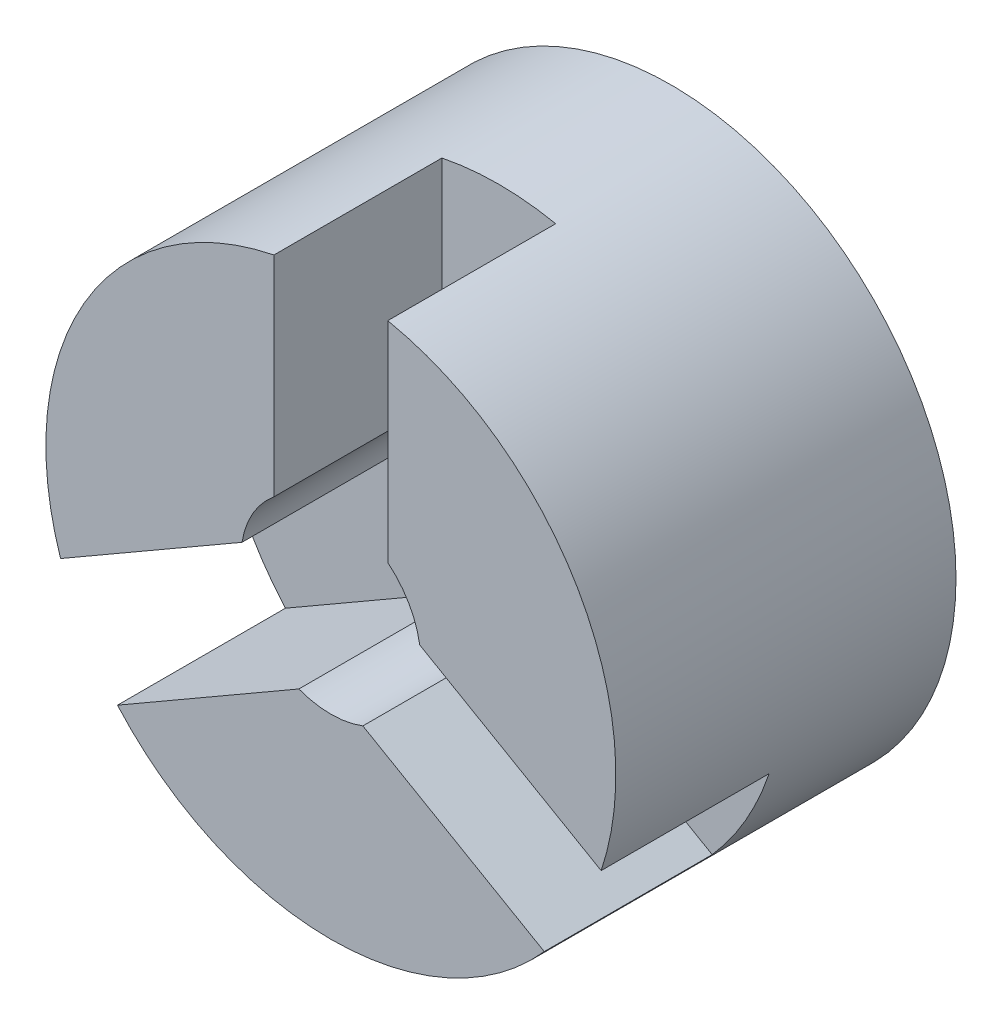
ISO-10303-21;
HEADER;
FILE_DESCRIPTION(('STEP AP214'),'2;1');
FILE_NAME('part.step','',(''),(''),'','','');
FILE_SCHEMA(('AUTOMOTIVE_DESIGN { 1 0 10303 214 1 1 1 1 }'));
ENDSEC;
DATA;
#1=APPLICATION_CONTEXT('core data for automotive mechanical design processes');
#2=APPLICATION_PROTOCOL_DEFINITION('international standard','automotive_design',2000,#1);
#3=PRODUCT_CONTEXT('',#1,'mechanical');
#4=PRODUCT('Part','Part','',(#3));
#5=PRODUCT_RELATED_PRODUCT_CATEGORY('part','',(#4));
#6=PRODUCT_DEFINITION_FORMATION('','',#4);
#7=PRODUCT_DEFINITION_CONTEXT('part definition',#1,'design');
#8=PRODUCT_DEFINITION('design','',#6,#7);
#9=PRODUCT_DEFINITION_SHAPE('','',#8);
#10=(LENGTH_UNIT() NAMED_UNIT(*) SI_UNIT(.MILLI.,.METRE.));
#11=(NAMED_UNIT(*) PLANE_ANGLE_UNIT() SI_UNIT($,.RADIAN.));
#12=(NAMED_UNIT(*) SI_UNIT($,.STERADIAN.) SOLID_ANGLE_UNIT());
#13=UNCERTAINTY_MEASURE_WITH_UNIT(LENGTH_MEASURE(1.E-05),#10,'distance_accuracy_value','');
#14=(GEOMETRIC_REPRESENTATION_CONTEXT(3) GLOBAL_UNCERTAINTY_ASSIGNED_CONTEXT((#13)) GLOBAL_UNIT_ASSIGNED_CONTEXT((#10,
#11,#12)) REPRESENTATION_CONTEXT('',''));
#15=CARTESIAN_POINT('',(0.,0.,0.));
#16=DIRECTION('',(0.,0.,1.));
#17=DIRECTION('',(1.,0.,0.));
#18=AXIS2_PLACEMENT_3D('',#15,#16,#17);
#19=CARTESIAN_POINT('',(4.9911,0.,20.107999916));
#20=DIRECTION('',(0.,0.,1.));
#21=DIRECTION('',(1.,0.,0.));
#22=AXIS2_PLACEMENT_3D('',#19,#20,#21);
#23=PLANE('',#22);
#24=CARTESIAN_POINT('',(0.,0.,20.107999916));
#25=DIRECTION('',(0.,0.,1.));
#26=DIRECTION('',(1.,0.,0.));
#27=AXIS2_PLACEMENT_3D('',#24,#25,#26);
#28=CIRCLE('',#27,7.8994);
#29=CARTESIAN_POINT('',(4.9911,6.12286216976995,20.107999916));
#30=VERTEX_POINT('',#29);
#31=CARTESIAN_POINT('',(-4.9911,6.12286216976995,20.107999916));
#32=VERTEX_POINT('',#31);
#33=EDGE_CURVE('E232',#30,#32,#28,.T.);
#34=ORIENTED_EDGE('',*,*,#33,.F.);
#35=DIRECTION('',(0.,1.,0.));
#36=VECTOR('',#35,1.);
#37=CARTESIAN_POINT('',(4.9911,0.,20.107999916));
#38=LINE('',#37,#36);
#39=CARTESIAN_POINT('',(4.9911,24.4967124486124,20.107999916));
#40=VERTEX_POINT('',#39);
#41=EDGE_CURVE('E172',#30,#40,#38,.T.);
#42=ORIENTED_EDGE('',*,*,#41,.T.);
#43=CARTESIAN_POINT('',(0.,0.,20.107999916));
#44=DIRECTION('',(0.,0.,1.));
#45=DIRECTION('',(1.,0.,0.));
#46=AXIS2_PLACEMENT_3D('',#43,#44,#45);
#47=CIRCLE('',#46,25.);
#48=CARTESIAN_POINT('',(-4.9911,24.4967124486124,20.107999916));
#49=VERTEX_POINT('',#48);
#50=EDGE_CURVE('E40',#40,#49,#47,.T.);
#51=ORIENTED_EDGE('',*,*,#50,.T.);
#52=DIRECTION('',(0.,-1.,0.));
#53=VECTOR('',#52,1.);
#54=CARTESIAN_POINT('',(-4.9911,26.8858011323426,20.107999916));
#55=LINE('',#54,#53);
#56=EDGE_CURVE('E174',#49,#32,#55,.T.);
#57=ORIENTED_EDGE('',*,*,#56,.T.);
#58=EDGE_LOOP('',(#34,#42,#51,#57));
#59=FACE_BOUND('',#58,.T.);
#60=ADVANCED_FACE('F32',(#59),#23,.T.);
#61=CARTESIAN_POINT('',(-7.79810418289149,1.2609883079435,20.107999916));
#62=VERTEX_POINT('',#61);
#63=CARTESIAN_POINT('',(-2.80700418289145,-7.3838504777135,20.107999916));
#64=VERTEX_POINT('',#63);
#65=EDGE_CURVE('E227',#62,#64,#28,.T.);
#66=ORIENTED_EDGE('',*,*,#65,.F.);
#67=DIRECTION('',(-0.866025403784436,-0.500000000000004,0.));
#68=VECTOR('',#67,1.);
#69=CARTESIAN_POINT('',(-2.49555000000002,4.3224193928285,20.107999916));
#70=LINE('',#69,#68);
#71=CARTESIAN_POINT('',(-23.7103252897008,-7.92593683147778,20.107999916));
#72=VERTEX_POINT('',#71);
#73=EDGE_CURVE('E149',#62,#72,#70,.T.);
#74=ORIENTED_EDGE('',*,*,#73,.T.);
#75=CARTESIAN_POINT('',(0.,0.,20.107999916));
#76=DIRECTION('',(0.,0.,1.));
#77=DIRECTION('',(1.,0.,0.));
#78=AXIS2_PLACEMENT_3D('',#75,#76,#77);
#79=CIRCLE('',#78,25.);
#80=CARTESIAN_POINT('',(-18.7192252897007,-16.5707756171348,20.107999916));
#81=VERTEX_POINT('',#80);
#82=EDGE_CURVE('E161',#72,#81,#79,.T.);
#83=ORIENTED_EDGE('',*,*,#82,.T.);
#84=DIRECTION('',(0.866025403784436,0.500000000000004,0.));
#85=VECTOR('',#84,1.);
#86=CARTESIAN_POINT('',(-20.7882367817051,-17.7653199589999,20.107999916));
#87=LINE('',#86,#85);
#88=EDGE_CURVE('E151',#81,#64,#87,.T.);
#89=ORIENTED_EDGE('',*,*,#88,.T.);
#90=EDGE_LOOP('',(#66,#74,#83,#89));
#91=FACE_BOUND('',#90,.T.);
#92=ADVANCED_FACE('F277',(#91),#23,.T.);
#93=CARTESIAN_POINT('',(0.,0.,34.839999916));
#94=DIRECTION('',(0.,0.,1.));
#95=DIRECTION('',(1.,0.,0.));
#96=AXIS2_PLACEMENT_3D('',#93,#94,#95);
#97=PLANE('',#96);
#98=CARTESIAN_POINT('',(0.,0.,34.839999916));
#99=DIRECTION('',(0.,0.,1.));
#100=DIRECTION('',(1.,0.,0.));
#101=AXIS2_PLACEMENT_3D('',#98,#99,#100);
#102=CIRCLE('',#101,7.8994);
#103=CARTESIAN_POINT('',(-4.9911,6.12286216976995,34.839999916));
#104=VERTEX_POINT('',#103);
#105=CARTESIAN_POINT('',(-7.79810418289149,1.2609883079435,34.839999916));
#106=VERTEX_POINT('',#105);
#107=EDGE_CURVE('E134',#104,#106,#102,.T.);
#108=ORIENTED_EDGE('',*,*,#107,.F.);
#109=DIRECTION('',(0.,-1.,0.));
#110=VECTOR('',#109,1.);
#111=CARTESIAN_POINT('',(-4.9911,0.,34.839999916));
#112=LINE('',#111,#110);
#113=CARTESIAN_POINT('',(-4.9911,24.4967124486124,34.839999916));
#114=VERTEX_POINT('',#113);
#115=EDGE_CURVE('E203',#114,#104,#112,.T.);
#116=ORIENTED_EDGE('',*,*,#115,.F.);
#117=CARTESIAN_POINT('',(0.,0.,34.839999916));
#118=DIRECTION('',(0.,0.,1.));
#119=DIRECTION('',(1.,0.,0.));
#120=AXIS2_PLACEMENT_3D('',#117,#118,#119);
#121=CIRCLE('',#120,25.);
#122=CARTESIAN_POINT('',(-23.7103252897008,-7.92593683147779,34.839999916));
#123=VERTEX_POINT('',#122);
#124=EDGE_CURVE('E184',#114,#123,#121,.T.);
#125=ORIENTED_EDGE('',*,*,#124,.T.);
#126=DIRECTION('',(-0.866025403784436,-0.500000000000004,0.));
#127=VECTOR('',#126,1.);
#128=CARTESIAN_POINT('',(-2.49555000000002,4.3224193928285,34.839999916));
#129=LINE('',#128,#127);
#130=EDGE_CURVE('E156',#106,#123,#129,.T.);
#131=ORIENTED_EDGE('',*,*,#130,.F.);
#132=EDGE_LOOP('',(#108,#116,#125,#131));
#133=FACE_BOUND('',#132,.T.);
#134=ADVANCED_FACE('F213',(#133),#97,.T.);
#135=CARTESIAN_POINT('',(7.79810418289147,1.26098830794361,34.839999916));
#136=VERTEX_POINT('',#135);
#137=CARTESIAN_POINT('',(4.9911,6.12286216976995,34.839999916));
#138=VERTEX_POINT('',#137);
#139=EDGE_CURVE('E119',#136,#138,#102,.T.);
#140=ORIENTED_EDGE('',*,*,#139,.F.);
#141=DIRECTION('',(-0.866025403784443,0.499999999999992,0.));
#142=VECTOR('',#141,1.);
#143=CARTESIAN_POINT('',(25.7793367817052,-9.12048117334257,34.839999916));
#144=LINE('',#143,#142);
#145=CARTESIAN_POINT('',(23.7103252897009,-7.92593683147745,34.839999916));
#146=VERTEX_POINT('',#145);
#147=EDGE_CURVE('E130',#146,#136,#144,.T.);
#148=ORIENTED_EDGE('',*,*,#147,.F.);
#149=CARTESIAN_POINT('',(4.9911,24.4967124486124,34.839999916));
#150=VERTEX_POINT('',#149);
#151=EDGE_CURVE('E189',#146,#150,#121,.T.);
#152=ORIENTED_EDGE('',*,*,#151,.T.);
#153=DIRECTION('',(0.,1.,0.));
#154=VECTOR('',#153,1.);
#155=CARTESIAN_POINT('',(4.9911,0.,34.839999916));
#156=LINE('',#155,#154);
#157=EDGE_CURVE('E132',#138,#150,#156,.T.);
#158=ORIENTED_EDGE('',*,*,#157,.F.);
#159=EDGE_LOOP('',(#140,#148,#152,#158));
#160=FACE_BOUND('',#159,.T.);
#161=ADVANCED_FACE('F128',(#160),#97,.T.);
#162=CARTESIAN_POINT('',(0.,0.,33.));
#163=DIRECTION('',(0.,0.,-1.));
#164=DIRECTION('',(-1.,0.,0.));
#165=AXIS2_PLACEMENT_3D('',#162,#163,#164);
#166=CYLINDRICAL_SURFACE('',#165,15.);
#167=CARTESIAN_POINT('',(0.,0.,0.));
#168=DIRECTION('',(0.,0.,1.));
#169=DIRECTION('',(1.,0.,0.));
#170=AXIS2_PLACEMENT_3D('',#167,#168,#169);
#171=CIRCLE('',#170,15.);
#172=CARTESIAN_POINT('',(15.,0.,0.));
#173=VERTEX_POINT('',#172);
#174=EDGE_CURVE('E195',#173,#173,#171,.T.);
#175=ORIENTED_EDGE('',*,*,#174,.T.);
#176=EDGE_LOOP('',(#175));
#177=FACE_BOUND('',#176,.T.);
#178=CARTESIAN_POINT('',(0.,0.,4.999999906));
#179=DIRECTION('',(0.,0.,1.));
#180=DIRECTION('',(1.,0.,0.));
#181=AXIS2_PLACEMENT_3D('',#178,#179,#180);
#182=CIRCLE('',#181,15.);
#183=CARTESIAN_POINT('',(15.,0.,4.999999906));
#184=VERTEX_POINT('',#183);
#185=EDGE_CURVE('E200',#184,#184,#182,.T.);
#186=ORIENTED_EDGE('',*,*,#185,.F.);
#187=EDGE_LOOP('',(#186));
#188=FACE_BOUND('',#187,.T.);
#189=ADVANCED_FACE('F34',(#177,#188),#166,.T.);
#190=CARTESIAN_POINT('',(0.,0.,0.));
#191=DIRECTION('',(0.,0.,1.));
#192=DIRECTION('',(1.,0.,0.));
#193=AXIS2_PLACEMENT_3D('',#190,#191,#192);
#194=PLANE('',#193);
#195=CARTESIAN_POINT('',(0.,0.,0.));
#196=DIRECTION('',(0.,0.,-1.));
#197=DIRECTION('',(-1.,0.,0.));
#198=AXIS2_PLACEMENT_3D('',#195,#196,#197);
#199=CIRCLE('',#198,7.5);
#200=CARTESIAN_POINT('',(-7.5,0.,0.));
#201=VERTEX_POINT('',#200);
#202=EDGE_CURVE('E187',#201,#201,#199,.T.);
#203=ORIENTED_EDGE('',*,*,#202,.F.);
#204=EDGE_LOOP('',(#203));
#205=FACE_BOUND('',#204,.T.);
#206=ORIENTED_EDGE('',*,*,#174,.F.);
#207=EDGE_LOOP('',(#206));
#208=FACE_BOUND('',#207,.T.);
#209=ADVANCED_FACE('F299',(#205,#208),#194,.F.);
#210=CARTESIAN_POINT('',(0.,0.,3.));
#211=DIRECTION('',(0.,0.,-1.));
#212=DIRECTION('',(-1.,0.,0.));
#213=AXIS2_PLACEMENT_3D('',#210,#211,#212);
#214=CYLINDRICAL_SURFACE('',#213,7.5);
#215=CARTESIAN_POINT('',(0.,0.,3.));
#216=DIRECTION('',(0.,0.,-1.));
#217=DIRECTION('',(-1.,0.,0.));
#218=AXIS2_PLACEMENT_3D('',#215,#216,#217);
#219=CIRCLE('',#218,7.5);
#220=CARTESIAN_POINT('',(-7.5,0.,3.));
#221=VERTEX_POINT('',#220);
#222=EDGE_CURVE('E192',#221,#221,#219,.T.);
#223=ORIENTED_EDGE('',*,*,#222,.F.);
#224=EDGE_LOOP('',(#223));
#225=FACE_BOUND('',#224,.T.);
#226=ORIENTED_EDGE('',*,*,#202,.T.);
#227=EDGE_LOOP('',(#226));
#228=FACE_BOUND('',#227,.T.);
#229=ADVANCED_FACE('F304',(#225,#228),#214,.F.);
#230=CARTESIAN_POINT('',(0.,0.,3.));
#231=DIRECTION('',(0.,0.,-1.));
#232=DIRECTION('',(-1.,0.,0.));
#233=AXIS2_PLACEMENT_3D('',#230,#231,#232);
#234=PLANE('',#233);
#235=CARTESIAN_POINT('',(0.,0.,3.));
#236=DIRECTION('',(0.,0.,-1.));
#237=DIRECTION('',(-1.,0.,0.));
#238=AXIS2_PLACEMENT_3D('',#235,#236,#237);
#239=CIRCLE('',#238,6.5);
#240=CARTESIAN_POINT('',(-6.5,0.,3.));
#241=VERTEX_POINT('',#240);
#242=EDGE_CURVE('E145',#241,#241,#239,.T.);
#243=ORIENTED_EDGE('',*,*,#242,.F.);
#244=EDGE_LOOP('',(#243));
#245=FACE_BOUND('',#244,.T.);
#246=ORIENTED_EDGE('',*,*,#222,.T.);
#247=EDGE_LOOP('',(#246));
#248=FACE_BOUND('',#247,.T.);
#249=ADVANCED_FACE('F311',(#245,#248),#234,.T.);
#250=CARTESIAN_POINT('',(0.,0.,4.999999906));
#251=DIRECTION('',(0.,0.,1.));
#252=DIRECTION('',(1.,0.,0.));
#253=AXIS2_PLACEMENT_3D('',#250,#251,#252);
#254=PLANE('',#253);
#255=CARTESIAN_POINT('',(0.,0.,4.999999906));
#256=DIRECTION('',(0.,0.,1.));
#257=DIRECTION('',(1.,0.,0.));
#258=AXIS2_PLACEMENT_3D('',#255,#256,#257);
#259=CIRCLE('',#258,25.);
#260=CARTESIAN_POINT('',(25.,0.,4.999999906));
#261=VERTEX_POINT('',#260);
#262=EDGE_CURVE('E183',#261,#261,#259,.T.);
#263=ORIENTED_EDGE('',*,*,#262,.F.);
#264=EDGE_LOOP('',(#263));
#265=FACE_BOUND('',#264,.T.);
#266=ORIENTED_EDGE('',*,*,#185,.T.);
#267=EDGE_LOOP('',(#266));
#268=FACE_BOUND('',#267,.T.);
#269=ADVANCED_FACE('F291',(#265,#268),#254,.F.);
#270=CARTESIAN_POINT('',(0.,0.,34.839999916));
#271=DIRECTION('',(0.,0.,-1.));
#272=DIRECTION('',(-1.,0.,0.));
#273=AXIS2_PLACEMENT_3D('',#270,#271,#272);
#274=CYLINDRICAL_SURFACE('',#273,25.);
#275=CARTESIAN_POINT('',(-18.7192252897007,-16.5707756171348,34.839999916));
#276=VERTEX_POINT('',#275);
#277=CARTESIAN_POINT('',(18.719225289701,-16.5707756171345,34.839999916));
#278=VERTEX_POINT('',#277);
#279=EDGE_CURVE('E188',#276,#278,#121,.T.);
#280=ORIENTED_EDGE('',*,*,#279,.F.);
#281=DIRECTION('',(0.,0.,-1.));
#282=VECTOR('',#281,1.);
#283=CARTESIAN_POINT('',(-18.7192252897007,-16.5707756171348,34.839999916));
#284=LINE('',#283,#282);
#285=EDGE_CURVE('E169',#276,#81,#284,.T.);
#286=ORIENTED_EDGE('',*,*,#285,.T.);
#287=ORIENTED_EDGE('',*,*,#82,.F.);
#288=DIRECTION('',(0.,0.,-1.));
#289=VECTOR('',#288,1.);
#290=CARTESIAN_POINT('',(-23.7103252897008,-7.92593683147778,34.839999916));
#291=LINE('',#290,#289);
#292=EDGE_CURVE('E163',#72,#123,#291,.F.);
#293=ORIENTED_EDGE('',*,*,#292,.T.);
#294=ORIENTED_EDGE('',*,*,#124,.F.);
#295=DIRECTION('',(0.,0.,-1.));
#296=VECTOR('',#295,1.);
#297=CARTESIAN_POINT('',(-4.9911,24.4967124486124,34.839999916));
#298=LINE('',#297,#296);
#299=EDGE_CURVE('E180',#114,#49,#298,.T.);
#300=ORIENTED_EDGE('',*,*,#299,.T.);
#301=ORIENTED_EDGE('',*,*,#50,.F.);
#302=DIRECTION('',(0.,0.,-1.));
#303=VECTOR('',#302,1.);
#304=CARTESIAN_POINT('',(4.9911,24.4967124486124,34.839999916));
#305=LINE('',#304,#303);
#306=EDGE_CURVE('E176',#40,#150,#305,.F.);
#307=ORIENTED_EDGE('',*,*,#306,.T.);
#308=ORIENTED_EDGE('',*,*,#151,.F.);
#309=DIRECTION('',(0.,0.,-1.));
#310=VECTOR('',#309,1.);
#311=CARTESIAN_POINT('',(23.7103252897009,-7.92593683147745,34.839999916));
#312=LINE('',#311,#310);
#313=CARTESIAN_POINT('',(23.7103252897009,-7.92593683147745,20.107999916));
#314=VERTEX_POINT('',#313);
#315=EDGE_CURVE('E139',#146,#314,#312,.T.);
#316=ORIENTED_EDGE('',*,*,#315,.T.);
#317=CARTESIAN_POINT('',(18.719225289701,-16.5707756171345,20.107999916));
#318=VERTEX_POINT('',#317);
#319=EDGE_CURVE('E155',#318,#314,#79,.T.);
#320=ORIENTED_EDGE('',*,*,#319,.F.);
#321=DIRECTION('',(0.,0.,-1.));
#322=VECTOR('',#321,1.);
#323=CARTESIAN_POINT('',(18.719225289701,-16.5707756171345,34.839999916));
#324=LINE('',#323,#322);
#325=EDGE_CURVE('E166',#318,#278,#324,.F.);
#326=ORIENTED_EDGE('',*,*,#325,.T.);
#327=EDGE_LOOP('',(#280,#286,#287,#293,#294,#300,#301,#307,#308,#316,#320,#326));
#328=FACE_BOUND('',#327,.T.);
#329=ORIENTED_EDGE('',*,*,#262,.T.);
#330=EDGE_LOOP('',(#329));
#331=FACE_BOUND('',#330,.T.);
#332=ADVANCED_FACE('F217',(#328,#331),#274,.T.);
#333=CARTESIAN_POINT('',(-2.80700418289145,-7.3838504777135,34.839999916));
#334=VERTEX_POINT('',#333);
#335=CARTESIAN_POINT('',(2.80700418289156,-7.38385047771346,34.839999916));
#336=VERTEX_POINT('',#335);
#337=EDGE_CURVE('E136',#334,#336,#102,.T.);
#338=ORIENTED_EDGE('',*,*,#337,.F.);
#339=DIRECTION('',(0.866025403784436,0.500000000000004,0.));
#340=VECTOR('',#339,1.);
#341=CARTESIAN_POINT('',(-20.7882367817051,-17.7653199589999,34.839999916));
#342=LINE('',#341,#340);
#343=EDGE_CURVE('E152',#276,#334,#342,.T.);
#344=ORIENTED_EDGE('',*,*,#343,.F.);
#345=ORIENTED_EDGE('',*,*,#279,.T.);
#346=DIRECTION('',(0.866025403784443,-0.499999999999992,0.));
#347=VECTOR('',#346,1.);
#348=CARTESIAN_POINT('',(-2.49554999999996,-4.32241939282853,34.839999916));
#349=LINE('',#348,#347);
#350=EDGE_CURVE('E141',#336,#278,#349,.T.);
#351=ORIENTED_EDGE('',*,*,#350,.F.);
#352=EDGE_LOOP('',(#338,#344,#345,#351));
#353=FACE_BOUND('',#352,.T.);
#354=ADVANCED_FACE('F252',(#353),#97,.T.);
#355=CARTESIAN_POINT('',(2.80700418289156,-7.38385047771346,20.107999916));
#356=VERTEX_POINT('',#355);
#357=CARTESIAN_POINT('',(7.79810418289147,1.26098830794361,20.107999916));
#358=VERTEX_POINT('',#357);
#359=EDGE_CURVE('E47',#356,#358,#28,.T.);
#360=ORIENTED_EDGE('',*,*,#359,.F.);
#361=DIRECTION('',(0.866025403784443,-0.499999999999992,0.));
#362=VECTOR('',#361,1.);
#363=CARTESIAN_POINT('',(-2.49554999999996,-4.32241939282853,20.107999916));
#364=LINE('',#363,#362);
#365=EDGE_CURVE('E140',#356,#318,#364,.T.);
#366=ORIENTED_EDGE('',*,*,#365,.T.);
#367=ORIENTED_EDGE('',*,*,#319,.T.);
#368=DIRECTION('',(-0.866025403784443,0.499999999999992,0.));
#369=VECTOR('',#368,1.);
#370=CARTESIAN_POINT('',(25.7793367817052,-9.12048117334257,20.107999916));
#371=LINE('',#370,#369);
#372=EDGE_CURVE('E143',#314,#358,#371,.T.);
#373=ORIENTED_EDGE('',*,*,#372,.T.);
#374=EDGE_LOOP('',(#360,#366,#367,#373));
#375=FACE_BOUND('',#374,.T.);
#376=ADVANCED_FACE('F243',(#375),#23,.T.);
#377=CARTESIAN_POINT('',(-4.9911,26.8858011323426,20.107999916));
#378=DIRECTION('',(-1.,0.,0.));
#379=DIRECTION('',(0.,-1.,0.));
#380=AXIS2_PLACEMENT_3D('',#377,#378,#379);
#381=PLANE('',#380);
#382=ORIENTED_EDGE('',*,*,#115,.T.);
#383=DIRECTION('',(0.,0.,1.));
#384=VECTOR('',#383,1.);
#385=CARTESIAN_POINT('',(-4.9911,6.12286216976995,-9.34287722922005));
#386=LINE('',#385,#384);
#387=EDGE_CURVE('E209',#104,#32,#386,.F.);
#388=ORIENTED_EDGE('',*,*,#387,.T.);
#389=ORIENTED_EDGE('',*,*,#56,.F.);
#390=ORIENTED_EDGE('',*,*,#299,.F.);
#391=EDGE_LOOP('',(#382,#388,#389,#390));
#392=FACE_BOUND('',#391,.T.);
#393=ADVANCED_FACE('F208',(#392),#381,.F.);
#394=CARTESIAN_POINT('',(4.9911,0.,20.107999916));
#395=DIRECTION('',(1.,0.,0.));
#396=DIRECTION('',(0.,0.,-1.));
#397=AXIS2_PLACEMENT_3D('',#394,#395,#396);
#398=PLANE('',#397);
#399=ORIENTED_EDGE('',*,*,#41,.F.);
#400=DIRECTION('',(0.,0.,1.));
#401=VECTOR('',#400,1.);
#402=CARTESIAN_POINT('',(4.9911,6.12286216976995,-9.34287722922005));
#403=LINE('',#402,#401);
#404=EDGE_CURVE('E238',#30,#138,#403,.T.);
#405=ORIENTED_EDGE('',*,*,#404,.T.);
#406=ORIENTED_EDGE('',*,*,#157,.T.);
#407=ORIENTED_EDGE('',*,*,#306,.F.);
#408=EDGE_LOOP('',(#399,#405,#406,#407));
#409=FACE_BOUND('',#408,.T.);
#410=ADVANCED_FACE('F264',(#409),#398,.F.);
#411=CARTESIAN_POINT('',(-20.7882367817051,-17.7653199589999,20.107999916));
#412=DIRECTION('',(0.500000000000004,-0.866025403784436,0.));
#413=DIRECTION('',(0.866025403784436,0.500000000000004,0.));
#414=AXIS2_PLACEMENT_3D('',#411,#412,#413);
#415=PLANE('',#414);
#416=ORIENTED_EDGE('',*,*,#343,.T.);
#417=DIRECTION('',(0.,0.,1.));
#418=VECTOR('',#417,1.);
#419=CARTESIAN_POINT('',(-2.80700418289145,-7.3838504777135,-9.34287722922005));
#420=LINE('',#419,#418);
#421=EDGE_CURVE('E230',#334,#64,#420,.F.);
#422=ORIENTED_EDGE('',*,*,#421,.T.);
#423=ORIENTED_EDGE('',*,*,#88,.F.);
#424=ORIENTED_EDGE('',*,*,#285,.F.);
#425=EDGE_LOOP('',(#416,#422,#423,#424));
#426=FACE_BOUND('',#425,.T.);
#427=ADVANCED_FACE('F266',(#426),#415,.F.);
#428=CARTESIAN_POINT('',(-2.49554999999996,-4.32241939282853,20.107999916));
#429=DIRECTION('',(-0.499999999999992,-0.866025403784443,0.));
#430=DIRECTION('',(0.866025403784443,-0.499999999999992,0.));
#431=AXIS2_PLACEMENT_3D('',#428,#429,#430);
#432=PLANE('',#431);
#433=ORIENTED_EDGE('',*,*,#365,.F.);
#434=DIRECTION('',(0.,0.,1.));
#435=VECTOR('',#434,1.);
#436=CARTESIAN_POINT('',(2.80700418289156,-7.38385047771346,-9.34287722922005));
#437=LINE('',#436,#435);
#438=EDGE_CURVE('E228',#356,#336,#437,.T.);
#439=ORIENTED_EDGE('',*,*,#438,.T.);
#440=ORIENTED_EDGE('',*,*,#350,.T.);
#441=ORIENTED_EDGE('',*,*,#325,.F.);
#442=EDGE_LOOP('',(#433,#439,#440,#441));
#443=FACE_BOUND('',#442,.T.);
#444=ADVANCED_FACE('F255',(#443),#432,.F.);
#445=CARTESIAN_POINT('',(-2.49555000000002,4.3224193928285,20.107999916));
#446=DIRECTION('',(-0.500000000000004,0.866025403784436,0.));
#447=DIRECTION('',(-0.866025403784436,-0.500000000000004,0.));
#448=AXIS2_PLACEMENT_3D('',#445,#446,#447);
#449=PLANE('',#448);
#450=ORIENTED_EDGE('',*,*,#73,.F.);
#451=DIRECTION('',(0.,0.,1.));
#452=VECTOR('',#451,1.);
#453=CARTESIAN_POINT('',(-7.79810418289149,1.2609883079435,-9.34287722922005));
#454=LINE('',#453,#452);
#455=EDGE_CURVE('E225',#62,#106,#454,.T.);
#456=ORIENTED_EDGE('',*,*,#455,.T.);
#457=ORIENTED_EDGE('',*,*,#130,.T.);
#458=ORIENTED_EDGE('',*,*,#292,.F.);
#459=EDGE_LOOP('',(#450,#456,#457,#458));
#460=FACE_BOUND('',#459,.T.);
#461=ADVANCED_FACE('F223',(#460),#449,.F.);
#462=CARTESIAN_POINT('',(25.7793367817052,-9.12048117334257,20.107999916));
#463=DIRECTION('',(0.499999999999992,0.866025403784443,0.));
#464=DIRECTION('',(-0.866025403784443,0.499999999999992,0.));
#465=AXIS2_PLACEMENT_3D('',#462,#463,#464);
#466=PLANE('',#465);
#467=ORIENTED_EDGE('',*,*,#147,.T.);
#468=DIRECTION('',(0.,0.,1.));
#469=VECTOR('',#468,1.);
#470=CARTESIAN_POINT('',(7.79810418289147,1.26098830794361,-9.34287722922005));
#471=LINE('',#470,#469);
#472=EDGE_CURVE('E11',#136,#358,#471,.F.);
#473=ORIENTED_EDGE('',*,*,#472,.T.);
#474=ORIENTED_EDGE('',*,*,#372,.F.);
#475=ORIENTED_EDGE('',*,*,#315,.F.);
#476=EDGE_LOOP('',(#467,#473,#474,#475));
#477=FACE_BOUND('',#476,.T.);
#478=ADVANCED_FACE('F137',(#477),#466,.F.);
#479=CARTESIAN_POINT('',(0.,0.,13.));
#480=DIRECTION('',(0.,0.,-1.));
#481=DIRECTION('',(-1.,0.,0.));
#482=AXIS2_PLACEMENT_3D('',#479,#480,#481);
#483=CYLINDRICAL_SURFACE('',#482,6.5);
#484=CARTESIAN_POINT('',(0.,0.,13.));
#485=DIRECTION('',(0.,0.,-1.));
#486=DIRECTION('',(-1.,0.,0.));
#487=AXIS2_PLACEMENT_3D('',#484,#485,#486);
#488=CIRCLE('',#487,6.5);
#489=CARTESIAN_POINT('',(-6.5,0.,13.));
#490=VERTEX_POINT('',#489);
#491=EDGE_CURVE('E259',#490,#490,#488,.F.);
#492=ORIENTED_EDGE('',*,*,#491,.T.);
#493=EDGE_LOOP('',(#492));
#494=FACE_BOUND('',#493,.T.);
#495=ORIENTED_EDGE('',*,*,#242,.T.);
#496=EDGE_LOOP('',(#495));
#497=FACE_BOUND('',#496,.T.);
#498=ADVANCED_FACE('F344',(#494,#497),#483,.F.);
#499=CARTESIAN_POINT('',(0.,0.,-9.34287722922005));
#500=DIRECTION('',(0.,0.,1.));
#501=DIRECTION('',(1.,0.,0.));
#502=AXIS2_PLACEMENT_3D('',#499,#500,#501);
#503=CYLINDRICAL_SURFACE('',#502,7.8994);
#504=CARTESIAN_POINT('',(0.,0.,13.));
#505=DIRECTION('',(0.,0.,-1.));
#506=DIRECTION('',(-1.,0.,0.));
#507=AXIS2_PLACEMENT_3D('',#504,#505,#506);
#508=CIRCLE('',#507,7.8994);
#509=CARTESIAN_POINT('',(-7.8994,0.,13.));
#510=VERTEX_POINT('',#509);
#511=EDGE_CURVE('E133',#510,#510,#508,.F.);
#512=ORIENTED_EDGE('',*,*,#511,.F.);
#513=EDGE_LOOP('',(#512));
#514=FACE_BOUND('',#513,.T.);
#515=ORIENTED_EDGE('',*,*,#107,.T.);
#516=ORIENTED_EDGE('',*,*,#455,.F.);
#517=ORIENTED_EDGE('',*,*,#65,.T.);
#518=ORIENTED_EDGE('',*,*,#421,.F.);
#519=ORIENTED_EDGE('',*,*,#337,.T.);
#520=ORIENTED_EDGE('',*,*,#438,.F.);
#521=ORIENTED_EDGE('',*,*,#359,.T.);
#522=ORIENTED_EDGE('',*,*,#472,.F.);
#523=ORIENTED_EDGE('',*,*,#139,.T.);
#524=ORIENTED_EDGE('',*,*,#404,.F.);
#525=ORIENTED_EDGE('',*,*,#33,.T.);
#526=ORIENTED_EDGE('',*,*,#387,.F.);
#527=EDGE_LOOP('',(#515,#516,#517,#518,#519,#520,#521,#522,#523,#524,#525,#526));
#528=FACE_BOUND('',#527,.T.);
#529=ADVANCED_FACE('F118',(#514,#528),#503,.F.);
#530=CARTESIAN_POINT('',(0.,0.,13.));
#531=DIRECTION('',(0.,0.,-1.));
#532=DIRECTION('',(-1.,0.,0.));
#533=AXIS2_PLACEMENT_3D('',#530,#531,#532);
#534=PLANE('',#533);
#535=ORIENTED_EDGE('',*,*,#511,.T.);
#536=EDGE_LOOP('',(#535));
#537=FACE_BOUND('',#536,.T.);
#538=ORIENTED_EDGE('',*,*,#491,.F.);
#539=EDGE_LOOP('',(#538));
#540=FACE_BOUND('',#539,.T.);
#541=ADVANCED_FACE('F428',(#537,#540),#534,.F.);
#542=CLOSED_SHELL('',(#60,#92,#134,#161,#189,#209,#229,#249,#269,#332,#354,#376,#393,#410,#427,
#444,#461,#478,#498,#529,#541));
#543=MANIFOLD_SOLID_BREP('B2',#542);
#544=ADVANCED_BREP_SHAPE_REPRESENTATION('',(#18,#543),#14);
#545=SHAPE_DEFINITION_REPRESENTATION(#9,#544);
ENDSEC;
END-ISO-10303-21;
